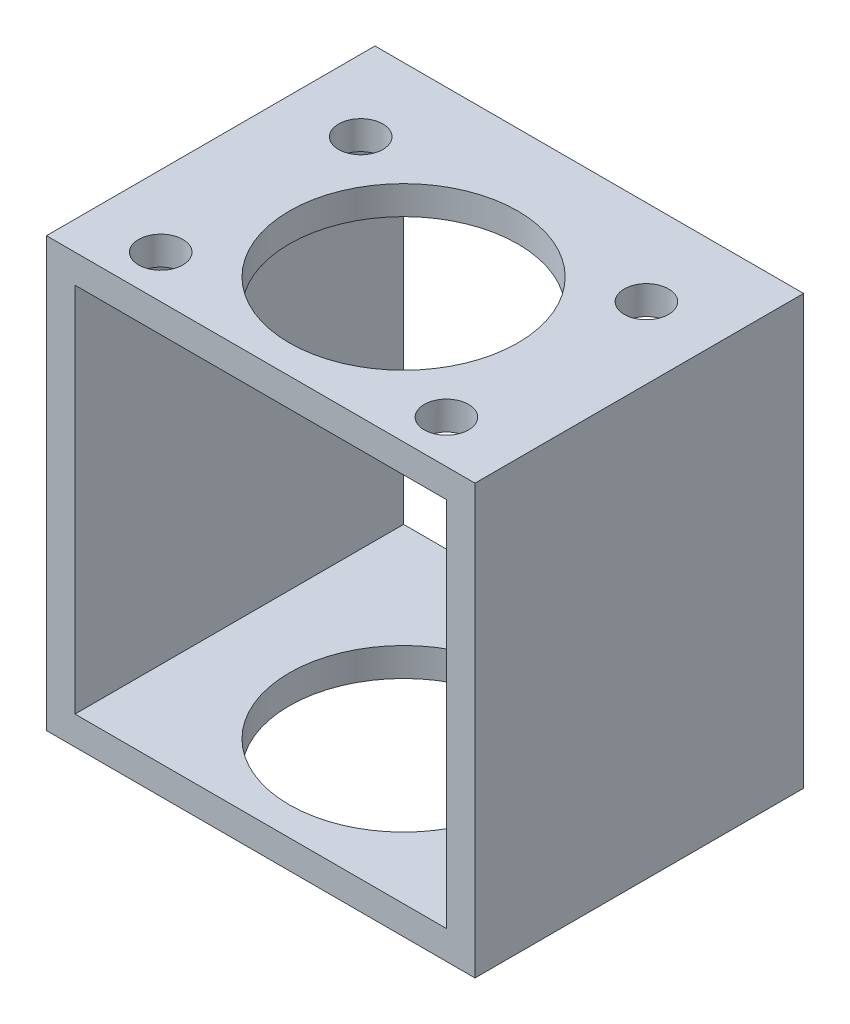
ISO-10303-21;
HEADER;
FILE_DESCRIPTION(('STEP AP214'),'2;1');
FILE_NAME('part.step','',(''),(''),'','','');
FILE_SCHEMA(('AUTOMOTIVE_DESIGN { 1 0 10303 214 1 1 1 1 }'));
ENDSEC;
DATA;
#1=APPLICATION_CONTEXT('core data for automotive mechanical design processes');
#2=APPLICATION_PROTOCOL_DEFINITION('international standard','automotive_design',2000,#1);
#3=PRODUCT_CONTEXT('',#1,'mechanical');
#4=PRODUCT('Part','Part','',(#3));
#5=PRODUCT_RELATED_PRODUCT_CATEGORY('part','',(#4));
#6=PRODUCT_DEFINITION_FORMATION('','',#4);
#7=PRODUCT_DEFINITION_CONTEXT('part definition',#1,'design');
#8=PRODUCT_DEFINITION('design','',#6,#7);
#9=PRODUCT_DEFINITION_SHAPE('','',#8);
#10=(LENGTH_UNIT() NAMED_UNIT(*) SI_UNIT(.MILLI.,.METRE.));
#11=(NAMED_UNIT(*) PLANE_ANGLE_UNIT() SI_UNIT($,.RADIAN.));
#12=(NAMED_UNIT(*) SI_UNIT($,.STERADIAN.) SOLID_ANGLE_UNIT());
#13=UNCERTAINTY_MEASURE_WITH_UNIT(LENGTH_MEASURE(1.E-05),#10,'distance_accuracy_value','');
#14=(GEOMETRIC_REPRESENTATION_CONTEXT(3) GLOBAL_UNCERTAINTY_ASSIGNED_CONTEXT((#13)) GLOBAL_UNIT_ASSIGNED_CONTEXT((#10,
#11,#12)) REPRESENTATION_CONTEXT('',''));
#15=CARTESIAN_POINT('',(0.,0.,0.));
#16=DIRECTION('',(0.,0.,1.));
#17=DIRECTION('',(1.,0.,0.));
#18=AXIS2_PLACEMENT_3D('',#15,#16,#17);
#19=CARTESIAN_POINT('',(0.,0.,23.));
#20=DIRECTION('',(0.,0.,-1.));
#21=DIRECTION('',(-1.,0.,0.));
#22=AXIS2_PLACEMENT_3D('',#19,#20,#21);
#23=PLANE('',#22);
#24=DIRECTION('',(0.,1.,0.));
#25=VECTOR('',#24,1.);
#26=CARTESIAN_POINT('',(15.,-15.,23.));
#27=LINE('',#26,#25);
#28=CARTESIAN_POINT('',(15.,-15.,23.));
#29=VERTEX_POINT('',#28);
#30=CARTESIAN_POINT('',(15.,15.,23.));
#31=VERTEX_POINT('',#30);
#32=EDGE_CURVE('E137',#29,#31,#27,.T.);
#33=ORIENTED_EDGE('',*,*,#32,.T.);
#34=DIRECTION('',(-1.,0.,0.));
#35=VECTOR('',#34,1.);
#36=CARTESIAN_POINT('',(-15.,15.,23.));
#37=LINE('',#36,#35);
#38=CARTESIAN_POINT('',(-15.,15.,23.));
#39=VERTEX_POINT('',#38);
#40=EDGE_CURVE('E140',#31,#39,#37,.T.);
#41=ORIENTED_EDGE('',*,*,#40,.T.);
#42=DIRECTION('',(0.,-1.,0.));
#43=VECTOR('',#42,1.);
#44=CARTESIAN_POINT('',(-15.,-15.,23.));
#45=LINE('',#44,#43);
#46=CARTESIAN_POINT('',(-15.,-15.,23.));
#47=VERTEX_POINT('',#46);
#48=EDGE_CURVE('E143',#39,#47,#45,.T.);
#49=ORIENTED_EDGE('',*,*,#48,.T.);
#50=DIRECTION('',(1.,0.,0.));
#51=VECTOR('',#50,1.);
#52=CARTESIAN_POINT('',(-15.,-15.,23.));
#53=LINE('',#52,#51);
#54=EDGE_CURVE('E145',#47,#29,#53,.T.);
#55=ORIENTED_EDGE('',*,*,#54,.T.);
#56=EDGE_LOOP('',(#33,#41,#49,#55));
#57=FACE_BOUND('',#56,.T.);
#58=DIRECTION('',(0.,1.,0.));
#59=VECTOR('',#58,1.);
#60=CARTESIAN_POINT('',(13.,13.,23.));
#61=LINE('',#60,#59);
#62=CARTESIAN_POINT('',(13.,-13.,23.));
#63=VERTEX_POINT('',#62);
#64=CARTESIAN_POINT('',(13.,13.,23.));
#65=VERTEX_POINT('',#64);
#66=EDGE_CURVE('E99',#63,#65,#61,.T.);
#67=ORIENTED_EDGE('',*,*,#66,.F.);
#68=DIRECTION('',(1.,0.,0.));
#69=VECTOR('',#68,1.);
#70=CARTESIAN_POINT('',(-13.,-13.,23.));
#71=LINE('',#70,#69);
#72=CARTESIAN_POINT('',(-13.,-13.,23.));
#73=VERTEX_POINT('',#72);
#74=EDGE_CURVE('E121',#73,#63,#71,.T.);
#75=ORIENTED_EDGE('',*,*,#74,.F.);
#76=DIRECTION('',(0.,-1.,0.));
#77=VECTOR('',#76,1.);
#78=CARTESIAN_POINT('',(-13.,13.,23.));
#79=LINE('',#78,#77);
#80=CARTESIAN_POINT('',(-13.,13.,23.));
#81=VERTEX_POINT('',#80);
#82=EDGE_CURVE('E119',#81,#73,#79,.T.);
#83=ORIENTED_EDGE('',*,*,#82,.F.);
#84=DIRECTION('',(-1.,0.,0.));
#85=VECTOR('',#84,1.);
#86=CARTESIAN_POINT('',(-13.,13.,23.));
#87=LINE('',#86,#85);
#88=EDGE_CURVE('E107',#65,#81,#87,.T.);
#89=ORIENTED_EDGE('',*,*,#88,.F.);
#90=EDGE_LOOP('',(#67,#75,#83,#89));
#91=FACE_BOUND('',#90,.T.);
#92=ADVANCED_FACE('F32',(#57,#91),#23,.F.);
#93=CARTESIAN_POINT('',(0.,0.,0.));
#94=DIRECTION('',(0.,0.,-1.));
#95=DIRECTION('',(-1.,0.,0.));
#96=AXIS2_PLACEMENT_3D('',#93,#94,#95);
#97=PLANE('',#96);
#98=DIRECTION('',(0.,1.,0.));
#99=VECTOR('',#98,1.);
#100=CARTESIAN_POINT('',(15.,-15.,0.));
#101=LINE('',#100,#99);
#102=CARTESIAN_POINT('',(15.,-15.,0.));
#103=VERTEX_POINT('',#102);
#104=CARTESIAN_POINT('',(15.,15.,0.));
#105=VERTEX_POINT('',#104);
#106=EDGE_CURVE('E115',#103,#105,#101,.T.);
#107=ORIENTED_EDGE('',*,*,#106,.F.);
#108=DIRECTION('',(1.,0.,0.));
#109=VECTOR('',#108,1.);
#110=CARTESIAN_POINT('',(-15.,-15.,0.));
#111=LINE('',#110,#109);
#112=CARTESIAN_POINT('',(-15.,-15.,0.));
#113=VERTEX_POINT('',#112);
#114=EDGE_CURVE('E141',#113,#103,#111,.T.);
#115=ORIENTED_EDGE('',*,*,#114,.F.);
#116=DIRECTION('',(0.,-1.,0.));
#117=VECTOR('',#116,1.);
#118=CARTESIAN_POINT('',(-15.,-15.,0.));
#119=LINE('',#118,#117);
#120=CARTESIAN_POINT('',(-15.,15.,0.));
#121=VERTEX_POINT('',#120);
#122=EDGE_CURVE('E152',#121,#113,#119,.T.);
#123=ORIENTED_EDGE('',*,*,#122,.F.);
#124=DIRECTION('',(-1.,0.,0.));
#125=VECTOR('',#124,1.);
#126=CARTESIAN_POINT('',(-15.,15.,0.));
#127=LINE('',#126,#125);
#128=EDGE_CURVE('E150',#105,#121,#127,.T.);
#129=ORIENTED_EDGE('',*,*,#128,.F.);
#130=EDGE_LOOP('',(#107,#115,#123,#129));
#131=FACE_BOUND('',#130,.T.);
#132=DIRECTION('',(1.,0.,0.));
#133=VECTOR('',#132,1.);
#134=CARTESIAN_POINT('',(-13.,-13.,0.));
#135=LINE('',#134,#133);
#136=CARTESIAN_POINT('',(-13.,-13.,0.));
#137=VERTEX_POINT('',#136);
#138=CARTESIAN_POINT('',(13.,-13.,0.));
#139=VERTEX_POINT('',#138);
#140=EDGE_CURVE('E108',#137,#139,#135,.T.);
#141=ORIENTED_EDGE('',*,*,#140,.T.);
#142=DIRECTION('',(0.,1.,0.));
#143=VECTOR('',#142,1.);
#144=CARTESIAN_POINT('',(13.,13.,0.));
#145=LINE('',#144,#143);
#146=CARTESIAN_POINT('',(13.,13.,0.));
#147=VERTEX_POINT('',#146);
#148=EDGE_CURVE('E57',#139,#147,#145,.T.);
#149=ORIENTED_EDGE('',*,*,#148,.T.);
#150=DIRECTION('',(-1.,0.,0.));
#151=VECTOR('',#150,1.);
#152=CARTESIAN_POINT('',(-13.,13.,0.));
#153=LINE('',#152,#151);
#154=CARTESIAN_POINT('',(-13.,13.,0.));
#155=VERTEX_POINT('',#154);
#156=EDGE_CURVE('E114',#147,#155,#153,.T.);
#157=ORIENTED_EDGE('',*,*,#156,.T.);
#158=DIRECTION('',(0.,-1.,0.));
#159=VECTOR('',#158,1.);
#160=CARTESIAN_POINT('',(-13.,13.,0.));
#161=LINE('',#160,#159);
#162=EDGE_CURVE('E129',#155,#137,#161,.T.);
#163=ORIENTED_EDGE('',*,*,#162,.T.);
#164=EDGE_LOOP('',(#141,#149,#157,#163));
#165=FACE_BOUND('',#164,.T.);
#166=ADVANCED_FACE('F217',(#131,#165),#97,.T.);
#167=CARTESIAN_POINT('',(15.,-15.,23.));
#168=DIRECTION('',(-1.,0.,0.));
#169=DIRECTION('',(0.,0.,1.));
#170=AXIS2_PLACEMENT_3D('',#167,#168,#169);
#171=PLANE('',#170);
#172=ORIENTED_EDGE('',*,*,#106,.T.);
#173=DIRECTION('',(0.,0.,-1.));
#174=VECTOR('',#173,1.);
#175=CARTESIAN_POINT('',(15.,15.,23.));
#176=LINE('',#175,#174);
#177=EDGE_CURVE('E11',#31,#105,#176,.T.);
#178=ORIENTED_EDGE('',*,*,#177,.F.);
#179=ORIENTED_EDGE('',*,*,#32,.F.);
#180=DIRECTION('',(0.,0.,-1.));
#181=VECTOR('',#180,1.);
#182=CARTESIAN_POINT('',(15.,-15.,23.));
#183=LINE('',#182,#181);
#184=EDGE_CURVE('E147',#29,#103,#183,.T.);
#185=ORIENTED_EDGE('',*,*,#184,.T.);
#186=EDGE_LOOP('',(#172,#178,#179,#185));
#187=FACE_BOUND('',#186,.T.);
#188=ADVANCED_FACE('F34',(#187),#171,.F.);
#189=CARTESIAN_POINT('',(-15.,15.,23.));
#190=DIRECTION('',(0.,-1.,0.));
#191=DIRECTION('',(0.,0.,-1.));
#192=AXIS2_PLACEMENT_3D('',#189,#190,#191);
#193=PLANE('',#192);
#194=CARTESIAN_POINT('',(-10.,15.,20.));
#195=DIRECTION('',(0.,1.,0.));
#196=DIRECTION('',(0.,0.,1.));
#197=AXIS2_PLACEMENT_3D('',#194,#195,#196);
#198=CIRCLE('',#197,1.55);
#199=CARTESIAN_POINT('',(-10.,15.,21.55));
#200=VERTEX_POINT('',#199);
#201=EDGE_CURVE('E185',#200,#200,#198,.T.);
#202=ORIENTED_EDGE('',*,*,#201,.F.);
#203=EDGE_LOOP('',(#202));
#204=FACE_BOUND('',#203,.T.);
#205=CARTESIAN_POINT('',(10.,15.,20.));
#206=DIRECTION('',(0.,1.,0.));
#207=DIRECTION('',(0.,0.,1.));
#208=AXIS2_PLACEMENT_3D('',#205,#206,#207);
#209=CIRCLE('',#208,1.55);
#210=CARTESIAN_POINT('',(10.,15.,21.55));
#211=VERTEX_POINT('',#210);
#212=EDGE_CURVE('E175',#211,#211,#209,.T.);
#213=ORIENTED_EDGE('',*,*,#212,.F.);
#214=EDGE_LOOP('',(#213));
#215=FACE_BOUND('',#214,.T.);
#216=CARTESIAN_POINT('',(-10.,15.,6.));
#217=DIRECTION('',(0.,1.,0.));
#218=DIRECTION('',(0.,0.,1.));
#219=AXIS2_PLACEMENT_3D('',#216,#217,#218);
#220=CIRCLE('',#219,1.55);
#221=CARTESIAN_POINT('',(-10.,15.,7.55));
#222=VERTEX_POINT('',#221);
#223=EDGE_CURVE('E172',#222,#222,#220,.T.);
#224=ORIENTED_EDGE('',*,*,#223,.F.);
#225=EDGE_LOOP('',(#224));
#226=FACE_BOUND('',#225,.T.);
#227=CARTESIAN_POINT('',(10.,15.,6.));
#228=DIRECTION('',(0.,1.,0.));
#229=DIRECTION('',(0.,0.,1.));
#230=AXIS2_PLACEMENT_3D('',#227,#228,#229);
#231=CIRCLE('',#230,1.55);
#232=CARTESIAN_POINT('',(10.,15.,7.55));
#233=VERTEX_POINT('',#232);
#234=EDGE_CURVE('E169',#233,#233,#231,.T.);
#235=ORIENTED_EDGE('',*,*,#234,.F.);
#236=EDGE_LOOP('',(#235));
#237=FACE_BOUND('',#236,.T.);
#238=CARTESIAN_POINT('',(0.,15.,13.));
#239=DIRECTION('',(0.,-1.,0.));
#240=DIRECTION('',(0.,0.,-1.));
#241=AXIS2_PLACEMENT_3D('',#238,#239,#240);
#242=CIRCLE('',#241,8.);
#243=CARTESIAN_POINT('',(0.,15.,4.99999999999999));
#244=VERTEX_POINT('',#243);
#245=EDGE_CURVE('E127',#244,#244,#242,.T.);
#246=ORIENTED_EDGE('',*,*,#245,.T.);
#247=EDGE_LOOP('',(#246));
#248=FACE_BOUND('',#247,.T.);
#249=ORIENTED_EDGE('',*,*,#128,.T.);
#250=DIRECTION('',(0.,0.,-1.));
#251=VECTOR('',#250,1.);
#252=CARTESIAN_POINT('',(-15.,15.,23.));
#253=LINE('',#252,#251);
#254=EDGE_CURVE('E41',#39,#121,#253,.T.);
#255=ORIENTED_EDGE('',*,*,#254,.F.);
#256=ORIENTED_EDGE('',*,*,#40,.F.);
#257=ORIENTED_EDGE('',*,*,#177,.T.);
#258=EDGE_LOOP('',(#249,#255,#256,#257));
#259=FACE_BOUND('',#258,.T.);
#260=ADVANCED_FACE('F197',(#204,#215,#226,#237,#248,#259),#193,.F.);
#261=CARTESIAN_POINT('',(-15.,-15.,23.));
#262=DIRECTION('',(1.,0.,0.));
#263=DIRECTION('',(0.,0.,-1.));
#264=AXIS2_PLACEMENT_3D('',#261,#262,#263);
#265=PLANE('',#264);
#266=ORIENTED_EDGE('',*,*,#122,.T.);
#267=DIRECTION('',(0.,0.,-1.));
#268=VECTOR('',#267,1.);
#269=CARTESIAN_POINT('',(-15.,-15.,23.));
#270=LINE('',#269,#268);
#271=EDGE_CURVE('E157',#47,#113,#270,.T.);
#272=ORIENTED_EDGE('',*,*,#271,.F.);
#273=ORIENTED_EDGE('',*,*,#48,.F.);
#274=ORIENTED_EDGE('',*,*,#254,.T.);
#275=EDGE_LOOP('',(#266,#272,#273,#274));
#276=FACE_BOUND('',#275,.T.);
#277=ADVANCED_FACE('F231',(#276),#265,.F.);
#278=CARTESIAN_POINT('',(-15.,-15.,23.));
#279=DIRECTION('',(0.,1.,0.));
#280=DIRECTION('',(0.,0.,1.));
#281=AXIS2_PLACEMENT_3D('',#278,#279,#280);
#282=PLANE('',#281);
#283=CARTESIAN_POINT('',(0.,-15.,13.));
#284=DIRECTION('',(0.,1.,0.));
#285=DIRECTION('',(0.,0.,1.));
#286=AXIS2_PLACEMENT_3D('',#283,#284,#285);
#287=CIRCLE('',#286,8.);
#288=CARTESIAN_POINT('',(0.,-15.,21.));
#289=VERTEX_POINT('',#288);
#290=EDGE_CURVE('E192',#289,#289,#287,.T.);
#291=ORIENTED_EDGE('',*,*,#290,.T.);
#292=EDGE_LOOP('',(#291));
#293=FACE_BOUND('',#292,.T.);
#294=ORIENTED_EDGE('',*,*,#114,.T.);
#295=ORIENTED_EDGE('',*,*,#184,.F.);
#296=ORIENTED_EDGE('',*,*,#54,.F.);
#297=ORIENTED_EDGE('',*,*,#271,.T.);
#298=EDGE_LOOP('',(#294,#295,#296,#297));
#299=FACE_BOUND('',#298,.T.);
#300=ADVANCED_FACE('F228',(#293,#299),#282,.F.);
#301=CARTESIAN_POINT('',(13.,13.,23.));
#302=DIRECTION('',(-1.,0.,0.));
#303=DIRECTION('',(0.,0.,1.));
#304=AXIS2_PLACEMENT_3D('',#301,#302,#303);
#305=PLANE('',#304);
#306=ORIENTED_EDGE('',*,*,#148,.F.);
#307=DIRECTION('',(0.,0.,-1.));
#308=VECTOR('',#307,1.);
#309=CARTESIAN_POINT('',(13.,-13.,23.));
#310=LINE('',#309,#308);
#311=EDGE_CURVE('E103',#63,#139,#310,.T.);
#312=ORIENTED_EDGE('',*,*,#311,.F.);
#313=ORIENTED_EDGE('',*,*,#66,.T.);
#314=DIRECTION('',(0.,0.,-1.));
#315=VECTOR('',#314,1.);
#316=CARTESIAN_POINT('',(13.,13.,23.));
#317=LINE('',#316,#315);
#318=EDGE_CURVE('E102',#65,#147,#317,.T.);
#319=ORIENTED_EDGE('',*,*,#318,.T.);
#320=EDGE_LOOP('',(#306,#312,#313,#319));
#321=FACE_BOUND('',#320,.T.);
#322=ADVANCED_FACE('F101',(#321),#305,.T.);
#323=CARTESIAN_POINT('',(-13.,13.,23.));
#324=DIRECTION('',(0.,-1.,0.));
#325=DIRECTION('',(1.,0.,0.));
#326=AXIS2_PLACEMENT_3D('',#323,#324,#325);
#327=PLANE('',#326);
#328=CARTESIAN_POINT('',(-10.,13.,20.));
#329=DIRECTION('',(0.,-1.,0.));
#330=DIRECTION('',(1.,0.,0.));
#331=AXIS2_PLACEMENT_3D('',#328,#329,#330);
#332=CIRCLE('',#331,1.55);
#333=CARTESIAN_POINT('',(-8.45,13.,20.));
#334=VERTEX_POINT('',#333);
#335=EDGE_CURVE('E36',#334,#334,#332,.T.);
#336=ORIENTED_EDGE('',*,*,#335,.F.);
#337=EDGE_LOOP('',(#336));
#338=FACE_BOUND('',#337,.T.);
#339=CARTESIAN_POINT('',(10.,13.,20.));
#340=DIRECTION('',(0.,-1.,0.));
#341=DIRECTION('',(1.,0.,0.));
#342=AXIS2_PLACEMENT_3D('',#339,#340,#341);
#343=CIRCLE('',#342,1.55);
#344=CARTESIAN_POINT('',(11.55,13.,20.));
#345=VERTEX_POINT('',#344);
#346=EDGE_CURVE('E173',#345,#345,#343,.T.);
#347=ORIENTED_EDGE('',*,*,#346,.F.);
#348=EDGE_LOOP('',(#347));
#349=FACE_BOUND('',#348,.T.);
#350=CARTESIAN_POINT('',(-10.,13.,6.));
#351=DIRECTION('',(0.,-1.,0.));
#352=DIRECTION('',(1.,0.,0.));
#353=AXIS2_PLACEMENT_3D('',#350,#351,#352);
#354=CIRCLE('',#353,1.55);
#355=CARTESIAN_POINT('',(-8.45,13.,6.));
#356=VERTEX_POINT('',#355);
#357=EDGE_CURVE('E170',#356,#356,#354,.T.);
#358=ORIENTED_EDGE('',*,*,#357,.F.);
#359=EDGE_LOOP('',(#358));
#360=FACE_BOUND('',#359,.T.);
#361=CARTESIAN_POINT('',(10.,13.,6.));
#362=DIRECTION('',(0.,-1.,0.));
#363=DIRECTION('',(1.,0.,0.));
#364=AXIS2_PLACEMENT_3D('',#361,#362,#363);
#365=CIRCLE('',#364,1.55);
#366=CARTESIAN_POINT('',(11.55,13.,6.));
#367=VERTEX_POINT('',#366);
#368=EDGE_CURVE('E166',#367,#367,#365,.T.);
#369=ORIENTED_EDGE('',*,*,#368,.F.);
#370=EDGE_LOOP('',(#369));
#371=FACE_BOUND('',#370,.T.);
#372=CARTESIAN_POINT('',(0.,13.,13.));
#373=DIRECTION('',(0.,-1.,0.));
#374=DIRECTION('',(1.,0.,0.));
#375=AXIS2_PLACEMENT_3D('',#372,#373,#374);
#376=CIRCLE('',#375,8.);
#377=CARTESIAN_POINT('',(8.,13.,13.));
#378=VERTEX_POINT('',#377);
#379=EDGE_CURVE('E165',#378,#378,#376,.T.);
#380=ORIENTED_EDGE('',*,*,#379,.F.);
#381=EDGE_LOOP('',(#380));
#382=FACE_BOUND('',#381,.T.);
#383=ORIENTED_EDGE('',*,*,#156,.F.);
#384=ORIENTED_EDGE('',*,*,#318,.F.);
#385=ORIENTED_EDGE('',*,*,#88,.T.);
#386=DIRECTION('',(0.,0.,-1.));
#387=VECTOR('',#386,1.);
#388=CARTESIAN_POINT('',(-13.,13.,23.));
#389=LINE('',#388,#387);
#390=EDGE_CURVE('E116',#81,#155,#389,.T.);
#391=ORIENTED_EDGE('',*,*,#390,.T.);
#392=EDGE_LOOP('',(#383,#384,#385,#391));
#393=FACE_BOUND('',#392,.T.);
#394=ADVANCED_FACE('F111',(#338,#349,#360,#371,#382,#393),#327,.T.);
#395=CARTESIAN_POINT('',(-13.,13.,23.));
#396=DIRECTION('',(1.,0.,0.));
#397=DIRECTION('',(0.,0.,-1.));
#398=AXIS2_PLACEMENT_3D('',#395,#396,#397);
#399=PLANE('',#398);
#400=ORIENTED_EDGE('',*,*,#162,.F.);
#401=ORIENTED_EDGE('',*,*,#390,.F.);
#402=ORIENTED_EDGE('',*,*,#82,.T.);
#403=DIRECTION('',(0.,0.,-1.));
#404=VECTOR('',#403,1.);
#405=CARTESIAN_POINT('',(-13.,-13.,23.));
#406=LINE('',#405,#404);
#407=EDGE_CURVE('E49',#73,#137,#406,.T.);
#408=ORIENTED_EDGE('',*,*,#407,.T.);
#409=EDGE_LOOP('',(#400,#401,#402,#408));
#410=FACE_BOUND('',#409,.T.);
#411=ADVANCED_FACE('F269',(#410),#399,.T.);
#412=CARTESIAN_POINT('',(-13.,-13.,23.));
#413=DIRECTION('',(0.,1.,0.));
#414=DIRECTION('',(0.,0.,1.));
#415=AXIS2_PLACEMENT_3D('',#412,#413,#414);
#416=PLANE('',#415);
#417=CARTESIAN_POINT('',(0.,-13.,13.));
#418=DIRECTION('',(0.,1.,0.));
#419=DIRECTION('',(0.,0.,1.));
#420=AXIS2_PLACEMENT_3D('',#417,#418,#419);
#421=CIRCLE('',#420,8.);
#422=CARTESIAN_POINT('',(0.,-13.,21.));
#423=VERTEX_POINT('',#422);
#424=EDGE_CURVE('E162',#423,#423,#421,.T.);
#425=ORIENTED_EDGE('',*,*,#424,.F.);
#426=EDGE_LOOP('',(#425));
#427=FACE_BOUND('',#426,.T.);
#428=ORIENTED_EDGE('',*,*,#140,.F.);
#429=ORIENTED_EDGE('',*,*,#407,.F.);
#430=ORIENTED_EDGE('',*,*,#74,.T.);
#431=ORIENTED_EDGE('',*,*,#311,.T.);
#432=EDGE_LOOP('',(#428,#429,#430,#431));
#433=FACE_BOUND('',#432,.T.);
#434=ADVANCED_FACE('F213',(#427,#433),#416,.T.);
#435=CARTESIAN_POINT('',(0.,-16.,13.));
#436=DIRECTION('',(0.,1.,0.));
#437=DIRECTION('',(0.,0.,1.));
#438=AXIS2_PLACEMENT_3D('',#435,#436,#437);
#439=CYLINDRICAL_SURFACE('',#438,8.);
#440=ORIENTED_EDGE('',*,*,#424,.T.);
#441=EDGE_LOOP('',(#440));
#442=FACE_BOUND('',#441,.T.);
#443=ORIENTED_EDGE('',*,*,#290,.F.);
#444=EDGE_LOOP('',(#443));
#445=FACE_BOUND('',#444,.T.);
#446=ADVANCED_FACE('F203',(#442,#445),#439,.F.);
#447=ORIENTED_EDGE('',*,*,#379,.T.);
#448=EDGE_LOOP('',(#447));
#449=FACE_BOUND('',#448,.T.);
#450=ORIENTED_EDGE('',*,*,#245,.F.);
#451=EDGE_LOOP('',(#450));
#452=FACE_BOUND('',#451,.T.);
#453=ADVANCED_FACE('F200',(#449,#452),#439,.F.);
#454=CARTESIAN_POINT('',(10.,12.,6.));
#455=DIRECTION('',(0.,1.,0.));
#456=DIRECTION('',(0.,0.,1.));
#457=AXIS2_PLACEMENT_3D('',#454,#455,#456);
#458=CYLINDRICAL_SURFACE('',#457,1.55);
#459=ORIENTED_EDGE('',*,*,#368,.T.);
#460=EDGE_LOOP('',(#459));
#461=FACE_BOUND('',#460,.T.);
#462=ORIENTED_EDGE('',*,*,#234,.T.);
#463=EDGE_LOOP('',(#462));
#464=FACE_BOUND('',#463,.T.);
#465=ADVANCED_FACE('F202',(#461,#464),#458,.F.);
#466=CARTESIAN_POINT('',(-10.,12.,6.));
#467=DIRECTION('',(0.,1.,0.));
#468=DIRECTION('',(0.,0.,1.));
#469=AXIS2_PLACEMENT_3D('',#466,#467,#468);
#470=CYLINDRICAL_SURFACE('',#469,1.55);
#471=ORIENTED_EDGE('',*,*,#357,.T.);
#472=EDGE_LOOP('',(#471));
#473=FACE_BOUND('',#472,.T.);
#474=ORIENTED_EDGE('',*,*,#223,.T.);
#475=EDGE_LOOP('',(#474));
#476=FACE_BOUND('',#475,.T.);
#477=ADVANCED_FACE('F210',(#473,#476),#470,.F.);
#478=CARTESIAN_POINT('',(10.,12.,20.));
#479=DIRECTION('',(0.,1.,0.));
#480=DIRECTION('',(0.,0.,1.));
#481=AXIS2_PLACEMENT_3D('',#478,#479,#480);
#482=CYLINDRICAL_SURFACE('',#481,1.55);
#483=ORIENTED_EDGE('',*,*,#346,.T.);
#484=EDGE_LOOP('',(#483));
#485=FACE_BOUND('',#484,.T.);
#486=ORIENTED_EDGE('',*,*,#212,.T.);
#487=EDGE_LOOP('',(#486));
#488=FACE_BOUND('',#487,.T.);
#489=ADVANCED_FACE('F251',(#485,#488),#482,.F.);
#490=CARTESIAN_POINT('',(-10.,12.,20.));
#491=DIRECTION('',(0.,1.,0.));
#492=DIRECTION('',(0.,0.,1.));
#493=AXIS2_PLACEMENT_3D('',#490,#491,#492);
#494=CYLINDRICAL_SURFACE('',#493,1.55);
#495=ORIENTED_EDGE('',*,*,#335,.T.);
#496=EDGE_LOOP('',(#495));
#497=FACE_BOUND('',#496,.T.);
#498=ORIENTED_EDGE('',*,*,#201,.T.);
#499=EDGE_LOOP('',(#498));
#500=FACE_BOUND('',#499,.T.);
#501=ADVANCED_FACE('F257',(#497,#500),#494,.F.);
#502=CLOSED_SHELL('',(#92,#166,#188,#260,#277,#300,#322,#394,#411,#434,#446,#453,#465,#477,#489,#501));
#503=MANIFOLD_SOLID_BREP('B2',#502);
#504=ADVANCED_BREP_SHAPE_REPRESENTATION('',(#18,#503),#14);
#505=SHAPE_DEFINITION_REPRESENTATION(#9,#504);
ENDSEC;
END-ISO-10303-21;
